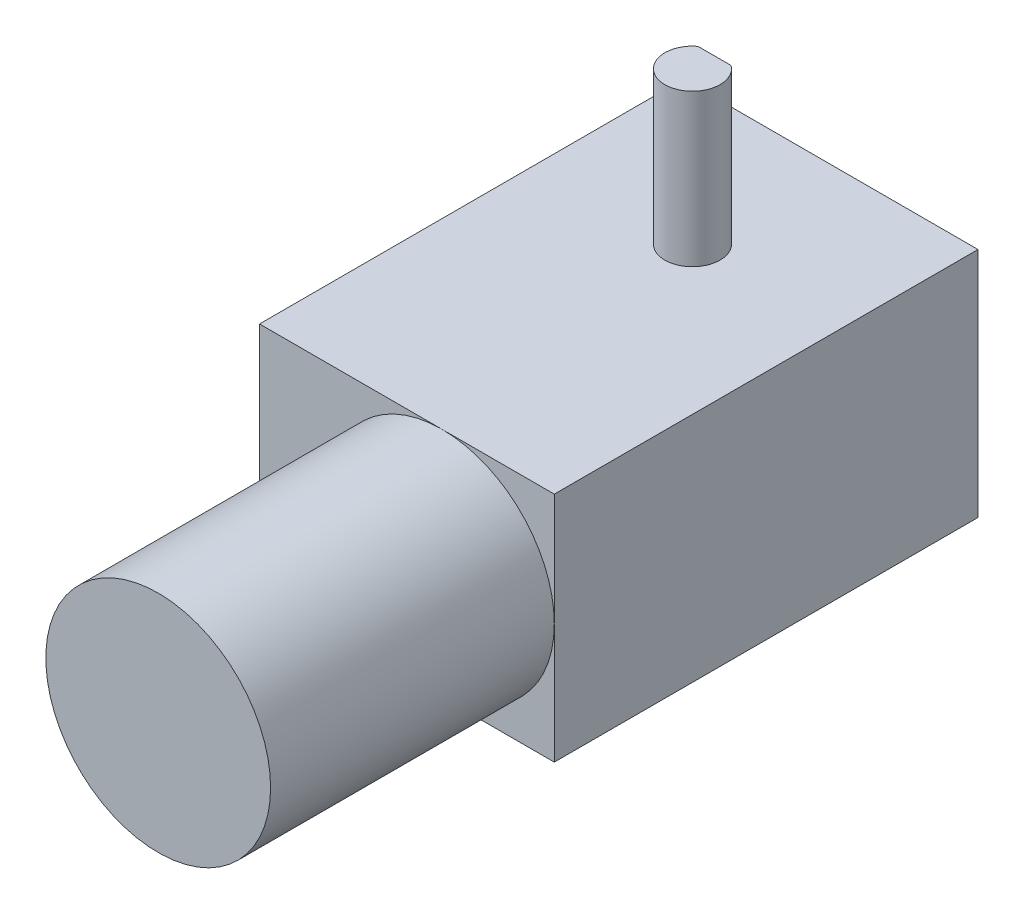
ISO-10303-21;
HEADER;
FILE_DESCRIPTION(('STEP AP214'),'2;1');
FILE_NAME('part.step','',(''),(''),'','','');
FILE_SCHEMA(('AUTOMOTIVE_DESIGN { 1 0 10303 214 1 1 1 1 }'));
ENDSEC;
DATA;
#1=APPLICATION_CONTEXT('core data for automotive mechanical design processes');
#2=APPLICATION_PROTOCOL_DEFINITION('international standard','automotive_design',2000,#1);
#3=PRODUCT_CONTEXT('',#1,'mechanical');
#4=PRODUCT('Part','Part','',(#3));
#5=PRODUCT_RELATED_PRODUCT_CATEGORY('part','',(#4));
#6=PRODUCT_DEFINITION_FORMATION('','',#4);
#7=PRODUCT_DEFINITION_CONTEXT('part definition',#1,'design');
#8=PRODUCT_DEFINITION('design','',#6,#7);
#9=PRODUCT_DEFINITION_SHAPE('','',#8);
#10=(LENGTH_UNIT() NAMED_UNIT(*) SI_UNIT(.MILLI.,.METRE.));
#11=(NAMED_UNIT(*) PLANE_ANGLE_UNIT() SI_UNIT($,.RADIAN.));
#12=(NAMED_UNIT(*) SI_UNIT($,.STERADIAN.) SOLID_ANGLE_UNIT());
#13=UNCERTAINTY_MEASURE_WITH_UNIT(LENGTH_MEASURE(1.E-05),#10,'distance_accuracy_value','');
#14=(GEOMETRIC_REPRESENTATION_CONTEXT(3) GLOBAL_UNCERTAINTY_ASSIGNED_CONTEXT((#13)) GLOBAL_UNIT_ASSIGNED_CONTEXT((#10,
#11,#12)) REPRESENTATION_CONTEXT('',''));
#15=CARTESIAN_POINT('',(0.,0.,0.));
#16=DIRECTION('',(0.,0.,1.));
#17=DIRECTION('',(1.,0.,0.));
#18=AXIS2_PLACEMENT_3D('',#15,#16,#17);
#19=CARTESIAN_POINT('',(-1.07552855510562E-13,25.2,31.0000000000001));
#20=DIRECTION('',(0.,0.,-1.));
#21=DIRECTION('',(-1.,0.,0.));
#22=AXIS2_PLACEMENT_3D('',#19,#20,#21);
#23=PLANE('',#22);
#24=CARTESIAN_POINT('',(3.79999999999996,13.,31.0000000000001));
#25=DIRECTION('',(0.,0.,1.));
#26=DIRECTION('',(1.,0.,0.));
#27=AXIS2_PLACEMENT_3D('',#24,#25,#26);
#28=CIRCLE('',#27,12.2);
#29=CARTESIAN_POINT('',(16.,13.,31.0000000000001));
#30=VERTEX_POINT('',#29);
#31=CARTESIAN_POINT('',(3.79999999999996,25.2,31.0000000000001));
#32=VERTEX_POINT('',#31);
#33=EDGE_CURVE('E50',#30,#32,#28,.T.);
#34=ORIENTED_EDGE('',*,*,#33,.F.);
#35=DIRECTION('',(0.,-1.,0.));
#36=VECTOR('',#35,1.);
#37=CARTESIAN_POINT('',(16.,25.2,31.0000000000001));
#38=LINE('',#37,#36);
#39=CARTESIAN_POINT('',(16.,25.2,31.0000000000001));
#40=VERTEX_POINT('',#39);
#41=EDGE_CURVE('E43',#40,#30,#38,.T.);
#42=ORIENTED_EDGE('',*,*,#41,.F.);
#43=DIRECTION('',(1.,0.,0.));
#44=VECTOR('',#43,1.);
#45=CARTESIAN_POINT('',(-1.07552855510562E-13,25.2,31.0000000000001));
#46=LINE('',#45,#44);
#47=EDGE_CURVE('E118',#32,#40,#46,.T.);
#48=ORIENTED_EDGE('',*,*,#47,.F.);
#49=EDGE_LOOP('',(#34,#42,#48));
#50=FACE_BOUND('',#49,.T.);
#51=ADVANCED_FACE('F39',(#50),#23,.F.);
#52=CARTESIAN_POINT('',(0.,25.2,0.));
#53=DIRECTION('',(0.,1.,0.));
#54=DIRECTION('',(0.,0.,1.));
#55=AXIS2_PLACEMENT_3D('',#52,#53,#54);
#56=PLANE('',#55);
#57=CARTESIAN_POINT('',(-16.0000000000001,25.2,31.));
#58=VERTEX_POINT('',#57);
#59=EDGE_CURVE('E196',#58,#32,#46,.T.);
#60=ORIENTED_EDGE('',*,*,#59,.T.);
#61=ORIENTED_EDGE('',*,*,#47,.T.);
#62=DIRECTION('',(0.,0.,-1.));
#63=VECTOR('',#62,1.);
#64=CARTESIAN_POINT('',(16.,25.2,0.));
#65=LINE('',#64,#63);
#66=CARTESIAN_POINT('',(16.0000000000001,25.2,-15.));
#67=VERTEX_POINT('',#66);
#68=EDGE_CURVE('E108',#40,#67,#65,.T.);
#69=ORIENTED_EDGE('',*,*,#68,.T.);
#70=DIRECTION('',(1.,0.,0.));
#71=VECTOR('',#70,1.);
#72=CARTESIAN_POINT('',(0.,25.2,-15.));
#73=LINE('',#72,#71);
#74=CARTESIAN_POINT('',(-16.0000000000001,25.2,-15.));
#75=VERTEX_POINT('',#74);
#76=EDGE_CURVE('E201',#75,#67,#73,.T.);
#77=ORIENTED_EDGE('',*,*,#76,.F.);
#78=DIRECTION('',(0.,0.,-1.));
#79=VECTOR('',#78,1.);
#80=CARTESIAN_POINT('',(-16.0000000000001,25.2,0.));
#81=LINE('',#80,#79);
#82=EDGE_CURVE('E205',#58,#75,#81,.T.);
#83=ORIENTED_EDGE('',*,*,#82,.F.);
#84=EDGE_LOOP('',(#60,#61,#69,#77,#83));
#85=FACE_BOUND('',#84,.T.);
#86=DIRECTION('',(-1.,0.,0.));
#87=VECTOR('',#86,1.);
#88=CARTESIAN_POINT('',(0.,25.2,-2.4));
#89=LINE('',#88,#87);
#90=CARTESIAN_POINT('',(1.8,25.2,-2.4));
#91=VERTEX_POINT('',#90);
#92=CARTESIAN_POINT('',(-1.8,25.2,-2.4));
#93=VERTEX_POINT('',#92);
#94=EDGE_CURVE('E174',#91,#93,#89,.T.);
#95=ORIENTED_EDGE('',*,*,#94,.F.);
#96=CARTESIAN_POINT('',(0.,25.2,0.));
#97=DIRECTION('',(0.,1.,0.));
#98=DIRECTION('',(0.,0.,1.));
#99=AXIS2_PLACEMENT_3D('',#96,#97,#98);
#100=CIRCLE('',#99,3.);
#101=EDGE_CURVE('E63',#93,#91,#100,.T.);
#102=ORIENTED_EDGE('',*,*,#101,.F.);
#103=EDGE_LOOP('',(#95,#102));
#104=FACE_BOUND('',#103,.T.);
#105=ADVANCED_FACE('F140',(#85,#104),#56,.T.);
#106=EDGE_CURVE('E11',#32,#30,#28,.T.);
#107=ORIENTED_EDGE('',*,*,#106,.F.);
#108=ORIENTED_EDGE('',*,*,#59,.F.);
#109=DIRECTION('',(0.,-1.,0.));
#110=VECTOR('',#109,1.);
#111=CARTESIAN_POINT('',(-16.0000000000001,25.2,31.));
#112=LINE('',#111,#110);
#113=CARTESIAN_POINT('',(-16.0000000000001,0.,31.));
#114=VERTEX_POINT('',#113);
#115=EDGE_CURVE('E209',#58,#114,#112,.T.);
#116=ORIENTED_EDGE('',*,*,#115,.T.);
#117=DIRECTION('',(1.,0.,0.));
#118=VECTOR('',#117,1.);
#119=CARTESIAN_POINT('',(-1.07552855510562E-13,0.,31.0000000000001));
#120=LINE('',#119,#118);
#121=CARTESIAN_POINT('',(16.,0.,31.0000000000001));
#122=VERTEX_POINT('',#121);
#123=EDGE_CURVE('E114',#114,#122,#120,.T.);
#124=ORIENTED_EDGE('',*,*,#123,.T.);
#125=EDGE_CURVE('E105',#30,#122,#38,.T.);
#126=ORIENTED_EDGE('',*,*,#125,.F.);
#127=EDGE_LOOP('',(#107,#108,#116,#124,#126));
#128=FACE_BOUND('',#127,.T.);
#129=ADVANCED_FACE('F41',(#128),#23,.F.);
#130=CARTESIAN_POINT('',(16.,25.2,0.));
#131=DIRECTION('',(-1.,0.,0.));
#132=DIRECTION('',(0.,0.,1.));
#133=AXIS2_PLACEMENT_3D('',#130,#131,#132);
#134=PLANE('',#133);
#135=DIRECTION('',(0.,0.,-1.));
#136=VECTOR('',#135,1.);
#137=CARTESIAN_POINT('',(16.,0.,0.));
#138=LINE('',#137,#136);
#139=CARTESIAN_POINT('',(16.0000000000001,0.,-15.));
#140=VERTEX_POINT('',#139);
#141=EDGE_CURVE('E212',#122,#140,#138,.T.);
#142=ORIENTED_EDGE('',*,*,#141,.T.);
#143=DIRECTION('',(0.,-1.,0.));
#144=VECTOR('',#143,1.);
#145=CARTESIAN_POINT('',(16.0000000000001,25.2,-15.));
#146=LINE('',#145,#144);
#147=EDGE_CURVE('E116',#67,#140,#146,.T.);
#148=ORIENTED_EDGE('',*,*,#147,.F.);
#149=ORIENTED_EDGE('',*,*,#68,.F.);
#150=ORIENTED_EDGE('',*,*,#41,.T.);
#151=ORIENTED_EDGE('',*,*,#125,.T.);
#152=EDGE_LOOP('',(#142,#148,#149,#150,#151));
#153=FACE_BOUND('',#152,.T.);
#154=ADVANCED_FACE('F104',(#153),#134,.F.);
#155=CARTESIAN_POINT('',(0.,25.2,-15.));
#156=DIRECTION('',(0.,0.,-1.));
#157=DIRECTION('',(-1.,0.,0.));
#158=AXIS2_PLACEMENT_3D('',#155,#156,#157);
#159=PLANE('',#158);
#160=DIRECTION('',(1.,0.,0.));
#161=VECTOR('',#160,1.);
#162=CARTESIAN_POINT('',(0.,0.,-15.));
#163=LINE('',#162,#161);
#164=CARTESIAN_POINT('',(-16.0000000000001,0.,-15.));
#165=VERTEX_POINT('',#164);
#166=EDGE_CURVE('E215',#165,#140,#163,.T.);
#167=ORIENTED_EDGE('',*,*,#166,.F.);
#168=DIRECTION('',(0.,-1.,0.));
#169=VECTOR('',#168,1.);
#170=CARTESIAN_POINT('',(-16.0000000000001,25.2,-15.));
#171=LINE('',#170,#169);
#172=EDGE_CURVE('E225',#75,#165,#171,.T.);
#173=ORIENTED_EDGE('',*,*,#172,.F.);
#174=ORIENTED_EDGE('',*,*,#76,.T.);
#175=ORIENTED_EDGE('',*,*,#147,.T.);
#176=EDGE_LOOP('',(#167,#173,#174,#175));
#177=FACE_BOUND('',#176,.T.);
#178=ADVANCED_FACE('F150',(#177),#159,.T.);
#179=CARTESIAN_POINT('',(-16.0000000000001,25.2,0.));
#180=DIRECTION('',(-1.,0.,0.));
#181=DIRECTION('',(0.,0.,1.));
#182=AXIS2_PLACEMENT_3D('',#179,#180,#181);
#183=PLANE('',#182);
#184=DIRECTION('',(0.,0.,-1.));
#185=VECTOR('',#184,1.);
#186=CARTESIAN_POINT('',(-16.0000000000001,0.,0.));
#187=LINE('',#186,#185);
#188=EDGE_CURVE('E219',#114,#165,#187,.T.);
#189=ORIENTED_EDGE('',*,*,#188,.F.);
#190=ORIENTED_EDGE('',*,*,#115,.F.);
#191=ORIENTED_EDGE('',*,*,#82,.T.);
#192=ORIENTED_EDGE('',*,*,#172,.T.);
#193=EDGE_LOOP('',(#189,#190,#191,#192));
#194=FACE_BOUND('',#193,.T.);
#195=ADVANCED_FACE('F154',(#194),#183,.T.);
#196=CARTESIAN_POINT('',(0.,0.,0.));
#197=DIRECTION('',(0.,1.,0.));
#198=DIRECTION('',(0.,0.,1.));
#199=AXIS2_PLACEMENT_3D('',#196,#197,#198);
#200=PLANE('',#199);
#201=ORIENTED_EDGE('',*,*,#123,.F.);
#202=ORIENTED_EDGE('',*,*,#188,.T.);
#203=ORIENTED_EDGE('',*,*,#166,.T.);
#204=ORIENTED_EDGE('',*,*,#141,.F.);
#205=EDGE_LOOP('',(#201,#202,#203,#204));
#206=FACE_BOUND('',#205,.T.);
#207=ADVANCED_FACE('F160',(#206),#200,.F.);
#208=CARTESIAN_POINT('',(0.,41.7,0.));
#209=DIRECTION('',(0.,-1.,0.));
#210=DIRECTION('',(0.,0.,-1.));
#211=AXIS2_PLACEMENT_3D('',#208,#209,#210);
#212=CYLINDRICAL_SURFACE('',#211,3.);
#213=ORIENTED_EDGE('',*,*,#101,.T.);
#214=DIRECTION('',(0.,-1.,0.));
#215=VECTOR('',#214,1.);
#216=CARTESIAN_POINT('',(1.8,41.7,-2.4));
#217=LINE('',#216,#215);
#218=CARTESIAN_POINT('',(1.8,41.7,-2.4));
#219=VERTEX_POINT('',#218);
#220=EDGE_CURVE('E177',#219,#91,#217,.T.);
#221=ORIENTED_EDGE('',*,*,#220,.F.);
#222=CARTESIAN_POINT('',(0.,41.7,0.));
#223=DIRECTION('',(0.,1.,0.));
#224=DIRECTION('',(0.,0.,1.));
#225=AXIS2_PLACEMENT_3D('',#222,#223,#224);
#226=CIRCLE('',#225,3.);
#227=CARTESIAN_POINT('',(-1.8,41.7,-2.4));
#228=VERTEX_POINT('',#227);
#229=EDGE_CURVE('E180',#228,#219,#226,.T.);
#230=ORIENTED_EDGE('',*,*,#229,.F.);
#231=DIRECTION('',(0.,-1.,0.));
#232=VECTOR('',#231,1.);
#233=CARTESIAN_POINT('',(-1.8,41.7,-2.4));
#234=LINE('',#233,#232);
#235=EDGE_CURVE('E175',#228,#93,#234,.T.);
#236=ORIENTED_EDGE('',*,*,#235,.T.);
#237=EDGE_LOOP('',(#213,#221,#230,#236));
#238=FACE_BOUND('',#237,.T.);
#239=ADVANCED_FACE('F163',(#238),#212,.T.);
#240=CARTESIAN_POINT('',(0.,41.7,-2.4));
#241=DIRECTION('',(0.,0.,1.));
#242=DIRECTION('',(1.,0.,0.));
#243=AXIS2_PLACEMENT_3D('',#240,#241,#242);
#244=PLANE('',#243);
#245=ORIENTED_EDGE('',*,*,#94,.T.);
#246=ORIENTED_EDGE('',*,*,#235,.F.);
#247=DIRECTION('',(-1.,0.,0.));
#248=VECTOR('',#247,1.);
#249=CARTESIAN_POINT('',(0.,41.7,-2.4));
#250=LINE('',#249,#248);
#251=EDGE_CURVE('E184',#219,#228,#250,.T.);
#252=ORIENTED_EDGE('',*,*,#251,.F.);
#253=ORIENTED_EDGE('',*,*,#220,.T.);
#254=EDGE_LOOP('',(#245,#246,#252,#253));
#255=FACE_BOUND('',#254,.T.);
#256=ADVANCED_FACE('F135',(#255),#244,.F.);
#257=CARTESIAN_POINT('',(0.,41.7,0.));
#258=DIRECTION('',(0.,1.,0.));
#259=DIRECTION('',(0.,0.,1.));
#260=AXIS2_PLACEMENT_3D('',#257,#258,#259);
#261=PLANE('',#260);
#262=ORIENTED_EDGE('',*,*,#229,.T.);
#263=ORIENTED_EDGE('',*,*,#251,.T.);
#264=EDGE_LOOP('',(#262,#263));
#265=FACE_BOUND('',#264,.T.);
#266=ADVANCED_FACE('F126',(#265),#261,.T.);
#267=CARTESIAN_POINT('',(3.79999999999996,13.,61.8000000000001));
#268=DIRECTION('',(0.,0.,-1.));
#269=DIRECTION('',(-1.,0.,0.));
#270=AXIS2_PLACEMENT_3D('',#267,#268,#269);
#271=CYLINDRICAL_SURFACE('',#270,12.2);
#272=CARTESIAN_POINT('',(3.79999999999996,13.,61.8000000000001));
#273=DIRECTION('',(0.,0.,1.));
#274=DIRECTION('',(1.,0.,0.));
#275=AXIS2_PLACEMENT_3D('',#272,#273,#274);
#276=CIRCLE('',#275,12.2);
#277=CARTESIAN_POINT('',(16.,13.,61.8000000000001));
#278=VERTEX_POINT('',#277);
#279=EDGE_CURVE('E122',#278,#278,#276,.T.);
#280=ORIENTED_EDGE('',*,*,#279,.F.);
#281=EDGE_LOOP('',(#280));
#282=FACE_BOUND('',#281,.T.);
#283=ORIENTED_EDGE('',*,*,#33,.T.);
#284=ORIENTED_EDGE('',*,*,#106,.T.);
#285=EDGE_LOOP('',(#283,#284));
#286=FACE_BOUND('',#285,.T.);
#287=ADVANCED_FACE('F123',(#282,#286),#271,.T.);
#288=CARTESIAN_POINT('',(3.79999999999996,13.,61.8000000000001));
#289=DIRECTION('',(0.,0.,1.));
#290=DIRECTION('',(1.,0.,0.));
#291=AXIS2_PLACEMENT_3D('',#288,#289,#290);
#292=PLANE('',#291);
#293=ORIENTED_EDGE('',*,*,#279,.T.);
#294=EDGE_LOOP('',(#293));
#295=FACE_BOUND('',#294,.T.);
#296=ADVANCED_FACE('F125',(#295),#292,.T.);
#297=CLOSED_SHELL('',(#51,#105,#129,#154,#178,#195,#207,#239,#256,#266,#287,#296));
#298=MANIFOLD_SOLID_BREP('B2',#297);
#299=ADVANCED_BREP_SHAPE_REPRESENTATION('',(#18,#298),#14);
#300=SHAPE_DEFINITION_REPRESENTATION(#9,#299);
ENDSEC;
END-ISO-10303-21;
